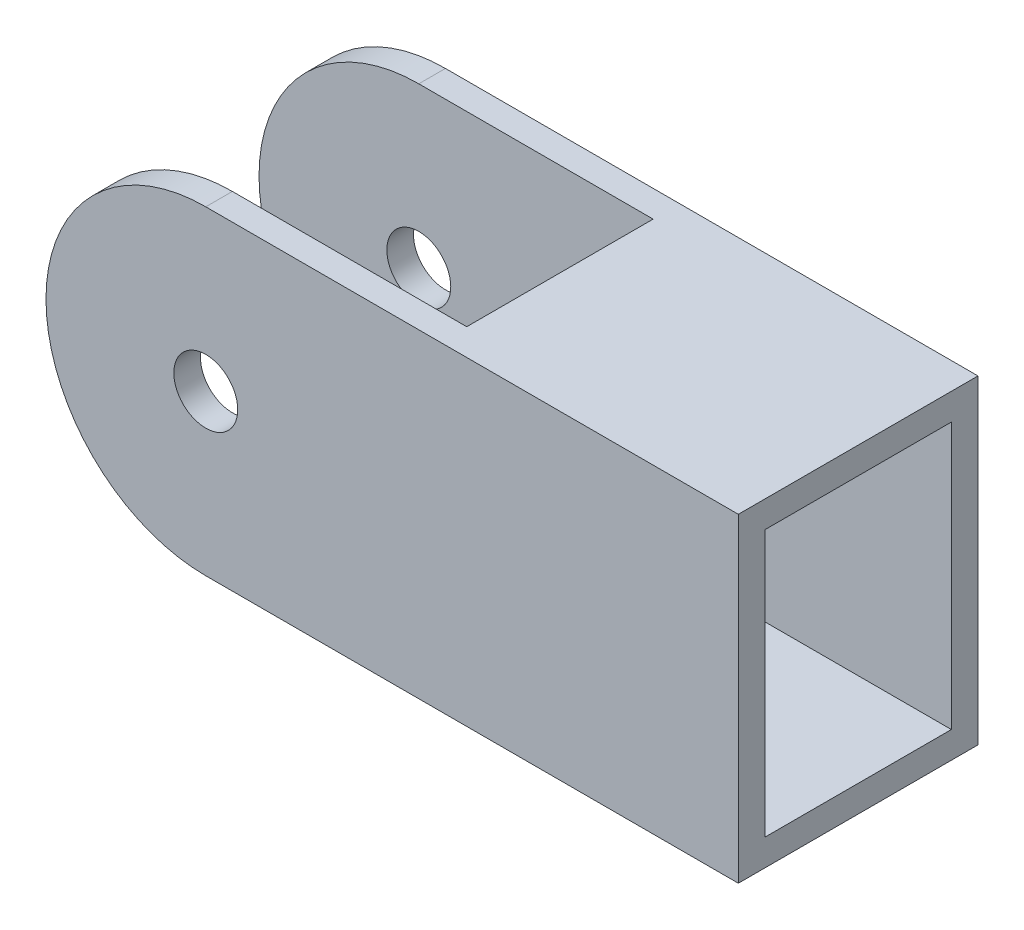
ISO-10303-21;
HEADER;
FILE_DESCRIPTION(('STEP AP214'),'2;1');
FILE_NAME('part.step','',(''),(''),'','','');
FILE_SCHEMA(('AUTOMOTIVE_DESIGN { 1 0 10303 214 1 1 1 1 }'));
ENDSEC;
DATA;
#1=APPLICATION_CONTEXT('core data for automotive mechanical design processes');
#2=APPLICATION_PROTOCOL_DEFINITION('international standard','automotive_design',2000,#1);
#3=PRODUCT_CONTEXT('',#1,'mechanical');
#4=PRODUCT('Part','Part','',(#3));
#5=PRODUCT_RELATED_PRODUCT_CATEGORY('part','',(#4));
#6=PRODUCT_DEFINITION_FORMATION('','',#4);
#7=PRODUCT_DEFINITION_CONTEXT('part definition',#1,'design');
#8=PRODUCT_DEFINITION('design','',#6,#7);
#9=PRODUCT_DEFINITION_SHAPE('','',#8);
#10=(LENGTH_UNIT() NAMED_UNIT(*) SI_UNIT(.MILLI.,.METRE.));
#11=(NAMED_UNIT(*) PLANE_ANGLE_UNIT() SI_UNIT($,.RADIAN.));
#12=(NAMED_UNIT(*) SI_UNIT($,.STERADIAN.) SOLID_ANGLE_UNIT());
#13=UNCERTAINTY_MEASURE_WITH_UNIT(LENGTH_MEASURE(1.E-05),#10,'distance_accuracy_value','');
#14=(GEOMETRIC_REPRESENTATION_CONTEXT(3) GLOBAL_UNCERTAINTY_ASSIGNED_CONTEXT((#13)) GLOBAL_UNIT_ASSIGNED_CONTEXT((#10,
#11,#12)) REPRESENTATION_CONTEXT('',''));
#15=CARTESIAN_POINT('',(0.,0.,0.));
#16=DIRECTION('',(0.,0.,1.));
#17=DIRECTION('',(1.,0.,0.));
#18=AXIS2_PLACEMENT_3D('',#15,#16,#17);
#19=CARTESIAN_POINT('',(50.,-30.,5.));
#20=DIRECTION('',(-1.,0.,0.));
#21=DIRECTION('',(0.,0.,1.));
#22=AXIS2_PLACEMENT_3D('',#19,#20,#21);
#23=PLANE('',#22);
#24=DIRECTION('',(0.,1.,0.));
#25=VECTOR('',#24,1.);
#26=CARTESIAN_POINT('',(50.,-30.,5.));
#27=LINE('',#26,#25);
#28=CARTESIAN_POINT('',(50.,-25.,5.));
#29=VERTEX_POINT('',#28);
#30=CARTESIAN_POINT('',(50.,25.,5.));
#31=VERTEX_POINT('',#30);
#32=EDGE_CURVE('E127',#29,#31,#27,.T.);
#33=ORIENTED_EDGE('',*,*,#32,.F.);
#34=DIRECTION('',(0.,0.,-1.));
#35=VECTOR('',#34,1.);
#36=CARTESIAN_POINT('',(50.,-25.,40.));
#37=LINE('',#36,#35);
#38=CARTESIAN_POINT('',(50.,-25.,40.));
#39=VERTEX_POINT('',#38);
#40=EDGE_CURVE('E120',#39,#29,#37,.T.);
#41=ORIENTED_EDGE('',*,*,#40,.F.);
#42=DIRECTION('',(0.,1.,0.));
#43=VECTOR('',#42,1.);
#44=CARTESIAN_POINT('',(50.,-30.,40.));
#45=LINE('',#44,#43);
#46=CARTESIAN_POINT('',(50.,25.,40.));
#47=VERTEX_POINT('',#46);
#48=EDGE_CURVE('E125',#39,#47,#45,.T.);
#49=ORIENTED_EDGE('',*,*,#48,.T.);
#50=DIRECTION('',(0.,0.,-1.));
#51=VECTOR('',#50,1.);
#52=CARTESIAN_POINT('',(50.,25.,40.));
#53=LINE('',#52,#51);
#54=EDGE_CURVE('E176',#47,#31,#53,.T.);
#55=ORIENTED_EDGE('',*,*,#54,.T.);
#56=EDGE_LOOP('',(#33,#41,#49,#55));
#57=FACE_BOUND('',#56,.T.);
#58=DIRECTION('',(0.,1.,0.));
#59=VECTOR('',#58,1.);
#60=CARTESIAN_POINT('',(50.,-30.,0.));
#61=LINE('',#60,#59);
#62=CARTESIAN_POINT('',(50.,-30.,0.));
#63=VERTEX_POINT('',#62);
#64=CARTESIAN_POINT('',(50.,30.,0.));
#65=VERTEX_POINT('',#64);
#66=EDGE_CURVE('E189',#63,#65,#61,.T.);
#67=ORIENTED_EDGE('',*,*,#66,.T.);
#68=DIRECTION('',(0.,0.,-1.));
#69=VECTOR('',#68,1.);
#70=CARTESIAN_POINT('',(50.,30.,5.));
#71=LINE('',#70,#69);
#72=CARTESIAN_POINT('',(50.,30.,45.));
#73=VERTEX_POINT('',#72);
#74=EDGE_CURVE('E11',#73,#65,#71,.T.);
#75=ORIENTED_EDGE('',*,*,#74,.F.);
#76=DIRECTION('',(0.,1.,0.));
#77=VECTOR('',#76,1.);
#78=CARTESIAN_POINT('',(50.,-30.,45.));
#79=LINE('',#78,#77);
#80=CARTESIAN_POINT('',(50.,-30.,45.));
#81=VERTEX_POINT('',#80);
#82=EDGE_CURVE('E162',#81,#73,#79,.T.);
#83=ORIENTED_EDGE('',*,*,#82,.F.);
#84=DIRECTION('',(0.,0.,-1.));
#85=VECTOR('',#84,1.);
#86=CARTESIAN_POINT('',(50.,-30.,5.));
#87=LINE('',#86,#85);
#88=EDGE_CURVE('E199',#81,#63,#87,.T.);
#89=ORIENTED_EDGE('',*,*,#88,.T.);
#90=EDGE_LOOP('',(#67,#75,#83,#89));
#91=FACE_BOUND('',#90,.T.);
#92=ADVANCED_FACE('F34',(#57,#91),#23,.F.);
#93=CARTESIAN_POINT('',(-50.,30.,5.));
#94=DIRECTION('',(0.,-1.,0.));
#95=DIRECTION('',(0.,0.,-1.));
#96=AXIS2_PLACEMENT_3D('',#93,#94,#95);
#97=PLANE('',#96);
#98=DIRECTION('',(-1.,0.,0.));
#99=VECTOR('',#98,1.);
#100=CARTESIAN_POINT('',(-50.,30.,0.));
#101=LINE('',#100,#99);
#102=CARTESIAN_POINT('',(-50.,30.,0.));
#103=VERTEX_POINT('',#102);
#104=EDGE_CURVE('E202',#65,#103,#101,.T.);
#105=ORIENTED_EDGE('',*,*,#104,.T.);
#106=DIRECTION('',(0.,0.,-1.));
#107=VECTOR('',#106,1.);
#108=CARTESIAN_POINT('',(-50.,30.,5.));
#109=LINE('',#108,#107);
#110=CARTESIAN_POINT('',(-50.,30.,5.));
#111=VERTEX_POINT('',#110);
#112=EDGE_CURVE('E41',#111,#103,#109,.T.);
#113=ORIENTED_EDGE('',*,*,#112,.F.);
#114=DIRECTION('',(-1.,0.,0.));
#115=VECTOR('',#114,1.);
#116=CARTESIAN_POINT('',(-50.,30.,5.));
#117=LINE('',#116,#115);
#118=CARTESIAN_POINT('',(-6.00000000000001,30.,5.));
#119=VERTEX_POINT('',#118);
#120=EDGE_CURVE('E193',#119,#111,#117,.T.);
#121=ORIENTED_EDGE('',*,*,#120,.F.);
#122=DIRECTION('',(0.,0.,-1.));
#123=VECTOR('',#122,1.);
#124=CARTESIAN_POINT('',(-6.00000000000001,30.,40.));
#125=LINE('',#124,#123);
#126=CARTESIAN_POINT('',(-6.00000000000001,30.,40.));
#127=VERTEX_POINT('',#126);
#128=EDGE_CURVE('E175',#127,#119,#125,.T.);
#129=ORIENTED_EDGE('',*,*,#128,.F.);
#130=DIRECTION('',(-1.,0.,0.));
#131=VECTOR('',#130,1.);
#132=CARTESIAN_POINT('',(-50.,30.,40.));
#133=LINE('',#132,#131);
#134=CARTESIAN_POINT('',(-50.,30.,40.));
#135=VERTEX_POINT('',#134);
#136=EDGE_CURVE('E144',#127,#135,#133,.T.);
#137=ORIENTED_EDGE('',*,*,#136,.T.);
#138=DIRECTION('',(0.,0.,1.));
#139=VECTOR('',#138,1.);
#140=CARTESIAN_POINT('',(-50.,30.,40.));
#141=LINE('',#140,#139);
#142=CARTESIAN_POINT('',(-50.,30.,45.));
#143=VERTEX_POINT('',#142);
#144=EDGE_CURVE('E172',#135,#143,#141,.T.);
#145=ORIENTED_EDGE('',*,*,#144,.T.);
#146=DIRECTION('',(-1.,0.,0.));
#147=VECTOR('',#146,1.);
#148=CARTESIAN_POINT('',(-50.,30.,45.));
#149=LINE('',#148,#147);
#150=EDGE_CURVE('E165',#73,#143,#149,.T.);
#151=ORIENTED_EDGE('',*,*,#150,.F.);
#152=ORIENTED_EDGE('',*,*,#74,.T.);
#153=EDGE_LOOP('',(#105,#113,#121,#129,#137,#145,#151,#152));
#154=FACE_BOUND('',#153,.T.);
#155=ADVANCED_FACE('F275',(#154),#97,.F.);
#156=CARTESIAN_POINT('',(-50.,0.,5.));
#157=DIRECTION('',(0.,0.,-1.));
#158=DIRECTION('',(-1.,0.,0.));
#159=AXIS2_PLACEMENT_3D('',#156,#157,#158);
#160=CYLINDRICAL_SURFACE('',#159,30.);
#161=CARTESIAN_POINT('',(-50.,0.,0.));
#162=DIRECTION('',(0.,0.,1.));
#163=DIRECTION('',(-1.,0.,0.));
#164=AXIS2_PLACEMENT_3D('',#161,#162,#163);
#165=CIRCLE('',#164,30.);
#166=CARTESIAN_POINT('',(-50.,-30.,0.));
#167=VERTEX_POINT('',#166);
#168=EDGE_CURVE('E204',#103,#167,#165,.T.);
#169=ORIENTED_EDGE('',*,*,#168,.T.);
#170=DIRECTION('',(0.,0.,-1.));
#171=VECTOR('',#170,1.);
#172=CARTESIAN_POINT('',(-50.,-30.,5.));
#173=LINE('',#172,#171);
#174=CARTESIAN_POINT('',(-50.,-30.,5.));
#175=VERTEX_POINT('',#174);
#176=EDGE_CURVE('E209',#175,#167,#173,.T.);
#177=ORIENTED_EDGE('',*,*,#176,.F.);
#178=CARTESIAN_POINT('',(-50.,0.,5.));
#179=DIRECTION('',(0.,0.,1.));
#180=DIRECTION('',(-1.,0.,0.));
#181=AXIS2_PLACEMENT_3D('',#178,#179,#180);
#182=CIRCLE('',#181,30.);
#183=EDGE_CURVE('E196',#111,#175,#182,.T.);
#184=ORIENTED_EDGE('',*,*,#183,.F.);
#185=ORIENTED_EDGE('',*,*,#112,.T.);
#186=EDGE_LOOP('',(#169,#177,#184,#185));
#187=FACE_BOUND('',#186,.T.);
#188=ADVANCED_FACE('F216',(#187),#160,.T.);
#189=CARTESIAN_POINT('',(-50.,-30.,5.));
#190=DIRECTION('',(0.,1.,0.));
#191=DIRECTION('',(0.,0.,1.));
#192=AXIS2_PLACEMENT_3D('',#189,#190,#191);
#193=PLANE('',#192);
#194=DIRECTION('',(1.,0.,0.));
#195=VECTOR('',#194,1.);
#196=CARTESIAN_POINT('',(-50.,-30.,0.));
#197=LINE('',#196,#195);
#198=EDGE_CURVE('E194',#167,#63,#197,.T.);
#199=ORIENTED_EDGE('',*,*,#198,.T.);
#200=ORIENTED_EDGE('',*,*,#88,.F.);
#201=DIRECTION('',(1.,0.,0.));
#202=VECTOR('',#201,1.);
#203=CARTESIAN_POINT('',(-50.,-30.,45.));
#204=LINE('',#203,#202);
#205=CARTESIAN_POINT('',(-50.,-30.,45.));
#206=VERTEX_POINT('',#205);
#207=EDGE_CURVE('E145',#206,#81,#204,.T.);
#208=ORIENTED_EDGE('',*,*,#207,.F.);
#209=DIRECTION('',(0.,0.,1.));
#210=VECTOR('',#209,1.);
#211=CARTESIAN_POINT('',(-50.,-30.,40.));
#212=LINE('',#211,#210);
#213=CARTESIAN_POINT('',(-50.,-30.,40.));
#214=VERTEX_POINT('',#213);
#215=EDGE_CURVE('E161',#214,#206,#212,.T.);
#216=ORIENTED_EDGE('',*,*,#215,.F.);
#217=DIRECTION('',(1.,0.,0.));
#218=VECTOR('',#217,1.);
#219=CARTESIAN_POINT('',(-50.,-30.,40.));
#220=LINE('',#219,#218);
#221=CARTESIAN_POINT('',(-6.00000000000001,-30.,40.));
#222=VERTEX_POINT('',#221);
#223=EDGE_CURVE('E158',#214,#222,#220,.T.);
#224=ORIENTED_EDGE('',*,*,#223,.T.);
#225=DIRECTION('',(0.,0.,-1.));
#226=VECTOR('',#225,1.);
#227=CARTESIAN_POINT('',(-6.00000000000001,-30.,40.));
#228=LINE('',#227,#226);
#229=CARTESIAN_POINT('',(-6.00000000000001,-30.,5.));
#230=VERTEX_POINT('',#229);
#231=EDGE_CURVE('E130',#222,#230,#228,.T.);
#232=ORIENTED_EDGE('',*,*,#231,.T.);
#233=DIRECTION('',(1.,0.,0.));
#234=VECTOR('',#233,1.);
#235=CARTESIAN_POINT('',(-50.,-30.,5.));
#236=LINE('',#235,#234);
#237=EDGE_CURVE('E53',#175,#230,#236,.T.);
#238=ORIENTED_EDGE('',*,*,#237,.F.);
#239=ORIENTED_EDGE('',*,*,#176,.T.);
#240=EDGE_LOOP('',(#199,#200,#208,#216,#224,#232,#238,#239));
#241=FACE_BOUND('',#240,.T.);
#242=ADVANCED_FACE('F225',(#241),#193,.F.);
#243=CARTESIAN_POINT('',(-50.,0.,5.));
#244=DIRECTION('',(0.,0.,-1.));
#245=DIRECTION('',(-1.,0.,0.));
#246=AXIS2_PLACEMENT_3D('',#243,#244,#245);
#247=PLANE('',#246);
#248=CARTESIAN_POINT('',(-50.,0.,5.));
#249=DIRECTION('',(0.,0.,-1.));
#250=DIRECTION('',(-1.,0.,0.));
#251=AXIS2_PLACEMENT_3D('',#248,#249,#250);
#252=CIRCLE('',#251,5.99999999999999);
#253=CARTESIAN_POINT('',(-44.,0.,5.));
#254=VERTEX_POINT('',#253);
#255=EDGE_CURVE('E237',#254,#254,#252,.T.);
#256=ORIENTED_EDGE('',*,*,#255,.T.);
#257=EDGE_LOOP('',(#256));
#258=FACE_BOUND('',#257,.T.);
#259=ORIENTED_EDGE('',*,*,#237,.T.);
#260=DIRECTION('',(0.,-1.,0.));
#261=VECTOR('',#260,1.);
#262=CARTESIAN_POINT('',(-6.00000000000001,-25.,5.));
#263=LINE('',#262,#261);
#264=CARTESIAN_POINT('',(-6.00000000000001,-25.,5.));
#265=VERTEX_POINT('',#264);
#266=EDGE_CURVE('E48',#265,#230,#263,.T.);
#267=ORIENTED_EDGE('',*,*,#266,.F.);
#268=DIRECTION('',(-1.,0.,0.));
#269=VECTOR('',#268,1.);
#270=CARTESIAN_POINT('',(50.,-25.,5.));
#271=LINE('',#270,#269);
#272=EDGE_CURVE('E243',#29,#265,#271,.T.);
#273=ORIENTED_EDGE('',*,*,#272,.F.);
#274=ORIENTED_EDGE('',*,*,#32,.T.);
#275=DIRECTION('',(-1.,0.,0.));
#276=VECTOR('',#275,1.);
#277=CARTESIAN_POINT('',(50.,25.,5.));
#278=LINE('',#277,#276);
#279=CARTESIAN_POINT('',(-6.00000000000001,25.,5.));
#280=VERTEX_POINT('',#279);
#281=EDGE_CURVE('E178',#31,#280,#278,.T.);
#282=ORIENTED_EDGE('',*,*,#281,.T.);
#283=DIRECTION('',(0.,1.,0.));
#284=VECTOR('',#283,1.);
#285=CARTESIAN_POINT('',(-6.00000000000001,25.,5.));
#286=LINE('',#285,#284);
#287=EDGE_CURVE('E184',#280,#119,#286,.T.);
#288=ORIENTED_EDGE('',*,*,#287,.T.);
#289=ORIENTED_EDGE('',*,*,#120,.T.);
#290=ORIENTED_EDGE('',*,*,#183,.T.);
#291=EDGE_LOOP('',(#259,#267,#273,#274,#282,#288,#289,#290));
#292=FACE_BOUND('',#291,.T.);
#293=ADVANCED_FACE('F263',(#258,#292),#247,.F.);
#294=CARTESIAN_POINT('',(-50.,0.,0.));
#295=DIRECTION('',(0.,0.,-1.));
#296=DIRECTION('',(-1.,0.,0.));
#297=AXIS2_PLACEMENT_3D('',#294,#295,#296);
#298=PLANE('',#297);
#299=CARTESIAN_POINT('',(-50.,0.,0.));
#300=DIRECTION('',(0.,0.,1.));
#301=DIRECTION('',(1.,0.,0.));
#302=AXIS2_PLACEMENT_3D('',#299,#300,#301);
#303=CIRCLE('',#302,5.99999999999999);
#304=CARTESIAN_POINT('',(-44.,0.,0.));
#305=VERTEX_POINT('',#304);
#306=EDGE_CURVE('E248',#305,#305,#303,.T.);
#307=ORIENTED_EDGE('',*,*,#306,.T.);
#308=EDGE_LOOP('',(#307));
#309=FACE_BOUND('',#308,.T.);
#310=ORIENTED_EDGE('',*,*,#66,.F.);
#311=ORIENTED_EDGE('',*,*,#198,.F.);
#312=ORIENTED_EDGE('',*,*,#168,.F.);
#313=ORIENTED_EDGE('',*,*,#104,.F.);
#314=EDGE_LOOP('',(#310,#311,#312,#313));
#315=FACE_BOUND('',#314,.T.);
#316=ADVANCED_FACE('F223',(#309,#315),#298,.T.);
#317=CARTESIAN_POINT('',(-6.00000000000001,25.,40.));
#318=DIRECTION('',(1.,0.,0.));
#319=DIRECTION('',(0.,0.,-1.));
#320=AXIS2_PLACEMENT_3D('',#317,#318,#319);
#321=PLANE('',#320);
#322=ORIENTED_EDGE('',*,*,#128,.T.);
#323=ORIENTED_EDGE('',*,*,#287,.F.);
#324=DIRECTION('',(0.,0.,-1.));
#325=VECTOR('',#324,1.);
#326=CARTESIAN_POINT('',(-6.00000000000001,25.,40.));
#327=LINE('',#326,#325);
#328=CARTESIAN_POINT('',(-6.00000000000001,25.,40.));
#329=VERTEX_POINT('',#328);
#330=EDGE_CURVE('E181',#329,#280,#327,.T.);
#331=ORIENTED_EDGE('',*,*,#330,.F.);
#332=DIRECTION('',(0.,1.,0.));
#333=VECTOR('',#332,1.);
#334=CARTESIAN_POINT('',(-6.00000000000001,25.,40.));
#335=LINE('',#334,#333);
#336=EDGE_CURVE('E186',#329,#127,#335,.T.);
#337=ORIENTED_EDGE('',*,*,#336,.T.);
#338=EDGE_LOOP('',(#322,#323,#331,#337));
#339=FACE_BOUND('',#338,.T.);
#340=ADVANCED_FACE('F270',(#339),#321,.F.);
#341=CARTESIAN_POINT('',(0.,25.,0.));
#342=DIRECTION('',(0.,1.,0.));
#343=DIRECTION('',(0.,0.,1.));
#344=AXIS2_PLACEMENT_3D('',#341,#342,#343);
#345=PLANE('',#344);
#346=ORIENTED_EDGE('',*,*,#54,.F.);
#347=DIRECTION('',(-1.,0.,0.));
#348=VECTOR('',#347,1.);
#349=CARTESIAN_POINT('',(50.,25.,40.));
#350=LINE('',#349,#348);
#351=EDGE_CURVE('E142',#47,#329,#350,.T.);
#352=ORIENTED_EDGE('',*,*,#351,.T.);
#353=ORIENTED_EDGE('',*,*,#330,.T.);
#354=ORIENTED_EDGE('',*,*,#281,.F.);
#355=EDGE_LOOP('',(#346,#352,#353,#354));
#356=FACE_BOUND('',#355,.T.);
#357=ADVANCED_FACE('F289',(#356),#345,.F.);
#358=CARTESIAN_POINT('',(-50.,0.,40.));
#359=DIRECTION('',(0.,0.,1.));
#360=DIRECTION('',(-1.,0.,0.));
#361=AXIS2_PLACEMENT_3D('',#358,#359,#360);
#362=CYLINDRICAL_SURFACE('',#361,30.);
#363=CARTESIAN_POINT('',(-50.,0.,45.));
#364=DIRECTION('',(0.,0.,1.));
#365=DIRECTION('',(-1.,0.,0.));
#366=AXIS2_PLACEMENT_3D('',#363,#364,#365);
#367=CIRCLE('',#366,30.);
#368=EDGE_CURVE('E150',#143,#206,#367,.T.);
#369=ORIENTED_EDGE('',*,*,#368,.F.);
#370=ORIENTED_EDGE('',*,*,#144,.F.);
#371=CARTESIAN_POINT('',(-50.,0.,40.));
#372=DIRECTION('',(0.,0.,1.));
#373=DIRECTION('',(-1.,0.,0.));
#374=AXIS2_PLACEMENT_3D('',#371,#372,#373);
#375=CIRCLE('',#374,30.);
#376=EDGE_CURVE('E147',#135,#214,#375,.T.);
#377=ORIENTED_EDGE('',*,*,#376,.T.);
#378=ORIENTED_EDGE('',*,*,#215,.T.);
#379=EDGE_LOOP('',(#369,#370,#377,#378));
#380=FACE_BOUND('',#379,.T.);
#381=ADVANCED_FACE('F232',(#380),#362,.T.);
#382=CARTESIAN_POINT('',(-50.,0.,40.));
#383=DIRECTION('',(0.,0.,1.));
#384=DIRECTION('',(-1.,0.,0.));
#385=AXIS2_PLACEMENT_3D('',#382,#383,#384);
#386=PLANE('',#385);
#387=CARTESIAN_POINT('',(-50.,0.,40.));
#388=DIRECTION('',(0.,0.,1.));
#389=DIRECTION('',(1.,0.,0.));
#390=AXIS2_PLACEMENT_3D('',#387,#388,#389);
#391=CIRCLE('',#390,5.99999999999999);
#392=CARTESIAN_POINT('',(-44.,0.,40.));
#393=VERTEX_POINT('',#392);
#394=EDGE_CURVE('E240',#393,#393,#391,.T.);
#395=ORIENTED_EDGE('',*,*,#394,.T.);
#396=EDGE_LOOP('',(#395));
#397=FACE_BOUND('',#396,.T.);
#398=DIRECTION('',(-1.,0.,0.));
#399=VECTOR('',#398,1.);
#400=CARTESIAN_POINT('',(50.,-25.,40.));
#401=LINE('',#400,#399);
#402=CARTESIAN_POINT('',(-6.00000000000001,-25.,40.));
#403=VERTEX_POINT('',#402);
#404=EDGE_CURVE('E129',#39,#403,#401,.T.);
#405=ORIENTED_EDGE('',*,*,#404,.T.);
#406=DIRECTION('',(0.,-1.,0.));
#407=VECTOR('',#406,1.);
#408=CARTESIAN_POINT('',(-6.00000000000001,-25.,40.));
#409=LINE('',#408,#407);
#410=EDGE_CURVE('E153',#403,#222,#409,.T.);
#411=ORIENTED_EDGE('',*,*,#410,.T.);
#412=ORIENTED_EDGE('',*,*,#223,.F.);
#413=ORIENTED_EDGE('',*,*,#376,.F.);
#414=ORIENTED_EDGE('',*,*,#136,.F.);
#415=ORIENTED_EDGE('',*,*,#336,.F.);
#416=ORIENTED_EDGE('',*,*,#351,.F.);
#417=ORIENTED_EDGE('',*,*,#48,.F.);
#418=EDGE_LOOP('',(#405,#411,#412,#413,#414,#415,#416,#417));
#419=FACE_BOUND('',#418,.T.);
#420=ADVANCED_FACE('F140',(#397,#419),#386,.F.);
#421=CARTESIAN_POINT('',(-50.,0.,45.));
#422=DIRECTION('',(0.,0.,1.));
#423=DIRECTION('',(-1.,0.,0.));
#424=AXIS2_PLACEMENT_3D('',#421,#422,#423);
#425=PLANE('',#424);
#426=CARTESIAN_POINT('',(-50.,0.,45.));
#427=DIRECTION('',(0.,0.,1.));
#428=DIRECTION('',(1.,0.,0.));
#429=AXIS2_PLACEMENT_3D('',#426,#427,#428);
#430=CIRCLE('',#429,5.99999999999999);
#431=CARTESIAN_POINT('',(-44.,0.,45.));
#432=VERTEX_POINT('',#431);
#433=EDGE_CURVE('E249',#432,#432,#430,.T.);
#434=ORIENTED_EDGE('',*,*,#433,.F.);
#435=EDGE_LOOP('',(#434));
#436=FACE_BOUND('',#435,.T.);
#437=ORIENTED_EDGE('',*,*,#82,.T.);
#438=ORIENTED_EDGE('',*,*,#150,.T.);
#439=ORIENTED_EDGE('',*,*,#368,.T.);
#440=ORIENTED_EDGE('',*,*,#207,.T.);
#441=EDGE_LOOP('',(#437,#438,#439,#440));
#442=FACE_BOUND('',#441,.T.);
#443=ADVANCED_FACE('F229',(#436,#442),#425,.T.);
#444=CARTESIAN_POINT('',(-6.00000000000001,-25.,40.));
#445=DIRECTION('',(-1.,0.,0.));
#446=DIRECTION('',(0.,0.,1.));
#447=AXIS2_PLACEMENT_3D('',#444,#445,#446);
#448=PLANE('',#447);
#449=ORIENTED_EDGE('',*,*,#231,.F.);
#450=ORIENTED_EDGE('',*,*,#410,.F.);
#451=DIRECTION('',(0.,0.,-1.));
#452=VECTOR('',#451,1.);
#453=CARTESIAN_POINT('',(-6.00000000000001,-25.,40.));
#454=LINE('',#453,#452);
#455=EDGE_CURVE('E136',#403,#265,#454,.T.);
#456=ORIENTED_EDGE('',*,*,#455,.T.);
#457=ORIENTED_EDGE('',*,*,#266,.T.);
#458=EDGE_LOOP('',(#449,#450,#456,#457));
#459=FACE_BOUND('',#458,.T.);
#460=ADVANCED_FACE('F300',(#459),#448,.T.);
#461=CARTESIAN_POINT('',(0.,-25.,0.));
#462=DIRECTION('',(0.,-1.,0.));
#463=DIRECTION('',(0.,0.,1.));
#464=AXIS2_PLACEMENT_3D('',#461,#462,#463);
#465=PLANE('',#464);
#466=ORIENTED_EDGE('',*,*,#40,.T.);
#467=ORIENTED_EDGE('',*,*,#272,.T.);
#468=ORIENTED_EDGE('',*,*,#455,.F.);
#469=ORIENTED_EDGE('',*,*,#404,.F.);
#470=EDGE_LOOP('',(#466,#467,#468,#469));
#471=FACE_BOUND('',#470,.T.);
#472=ADVANCED_FACE('F134',(#471),#465,.F.);
#473=CARTESIAN_POINT('',(-50.,0.,0.));
#474=DIRECTION('',(0.,0.,1.));
#475=DIRECTION('',(1.,0.,0.));
#476=AXIS2_PLACEMENT_3D('',#473,#474,#475);
#477=CYLINDRICAL_SURFACE('',#476,5.99999999999999);
#478=CARTESIAN_POINT('',(-44.,0.,45.));
#479=CARTESIAN_POINT('',(-44.,0.,44.9479166666667));
#480=CARTESIAN_POINT('',(-44.,0.,44.8958333333333));
#481=CARTESIAN_POINT('',(-44.,0.,44.7916666666667));
#482=CARTESIAN_POINT('',(-44.,0.,44.7395833333333));
#483=CARTESIAN_POINT('',(-44.,0.,44.6354166666667));
#484=CARTESIAN_POINT('',(-44.,0.,44.5833333333333));
#485=CARTESIAN_POINT('',(-44.,0.,44.4791666666667));
#486=CARTESIAN_POINT('',(-44.,0.,44.4270833333333));
#487=CARTESIAN_POINT('',(-44.,0.,44.3229166666667));
#488=CARTESIAN_POINT('',(-44.,0.,44.2708333333333));
#489=CARTESIAN_POINT('',(-44.,0.,44.1666666666667));
#490=CARTESIAN_POINT('',(-44.,0.,44.1145833333333));
#491=CARTESIAN_POINT('',(-44.,0.,44.0104166666667));
#492=CARTESIAN_POINT('',(-44.,0.,43.9583333333333));
#493=CARTESIAN_POINT('',(-44.,0.,43.8541666666667));
#494=CARTESIAN_POINT('',(-44.,0.,43.8020833333333));
#495=CARTESIAN_POINT('',(-44.,0.,43.6979166666667));
#496=CARTESIAN_POINT('',(-44.,0.,43.6458333333333));
#497=CARTESIAN_POINT('',(-44.,0.,43.5416666666667));
#498=CARTESIAN_POINT('',(-44.,0.,43.4895833333333));
#499=CARTESIAN_POINT('',(-44.,0.,43.3854166666667));
#500=CARTESIAN_POINT('',(-44.,0.,43.3333333333333));
#501=CARTESIAN_POINT('',(-44.,0.,43.2291666666667));
#502=CARTESIAN_POINT('',(-44.,0.,43.1770833333333));
#503=CARTESIAN_POINT('',(-44.,0.,43.0729166666667));
#504=CARTESIAN_POINT('',(-44.,0.,43.0208333333333));
#505=CARTESIAN_POINT('',(-44.,0.,42.9166666666667));
#506=CARTESIAN_POINT('',(-44.,0.,42.8645833333333));
#507=CARTESIAN_POINT('',(-44.,0.,42.7604166666667));
#508=CARTESIAN_POINT('',(-44.,0.,42.7083333333333));
#509=CARTESIAN_POINT('',(-44.,0.,42.6041666666667));
#510=CARTESIAN_POINT('',(-44.,0.,42.5520833333333));
#511=CARTESIAN_POINT('',(-44.,0.,42.4479166666667));
#512=CARTESIAN_POINT('',(-44.,0.,42.3958333333333));
#513=CARTESIAN_POINT('',(-44.,0.,42.2916666666667));
#514=CARTESIAN_POINT('',(-44.,0.,42.2395833333333));
#515=CARTESIAN_POINT('',(-44.,0.,42.1354166666667));
#516=CARTESIAN_POINT('',(-44.,0.,42.0833333333333));
#517=CARTESIAN_POINT('',(-44.,0.,41.9791666666667));
#518=CARTESIAN_POINT('',(-44.,0.,41.9270833333333));
#519=CARTESIAN_POINT('',(-44.,0.,41.8229166666667));
#520=CARTESIAN_POINT('',(-44.,0.,41.7708333333333));
#521=CARTESIAN_POINT('',(-44.,0.,41.6666666666667));
#522=CARTESIAN_POINT('',(-44.,0.,41.6145833333333));
#523=CARTESIAN_POINT('',(-44.,0.,41.5104166666667));
#524=CARTESIAN_POINT('',(-44.,0.,41.4583333333333));
#525=CARTESIAN_POINT('',(-44.,0.,41.3541666666667));
#526=CARTESIAN_POINT('',(-44.,0.,41.3020833333333));
#527=CARTESIAN_POINT('',(-44.,0.,41.1979166666667));
#528=CARTESIAN_POINT('',(-44.,0.,41.1458333333333));
#529=CARTESIAN_POINT('',(-44.,0.,41.0416666666667));
#530=CARTESIAN_POINT('',(-44.,0.,40.9895833333333));
#531=CARTESIAN_POINT('',(-44.,0.,40.8854166666667));
#532=CARTESIAN_POINT('',(-44.,0.,40.8333333333333));
#533=CARTESIAN_POINT('',(-44.,0.,40.7291666666667));
#534=CARTESIAN_POINT('',(-44.,0.,40.6770833333333));
#535=CARTESIAN_POINT('',(-44.,0.,40.5729166666667));
#536=CARTESIAN_POINT('',(-44.,0.,40.5208333333333));
#537=CARTESIAN_POINT('',(-44.,0.,40.4166666666667));
#538=CARTESIAN_POINT('',(-44.,0.,40.3645833333333));
#539=CARTESIAN_POINT('',(-44.,0.,40.2604166666667));
#540=CARTESIAN_POINT('',(-44.,0.,40.2083333333333));
#541=CARTESIAN_POINT('',(-44.,0.,40.1041666666667));
#542=CARTESIAN_POINT('',(-44.,0.,40.0520833333333));
#543=CARTESIAN_POINT('',(-44.,0.,40.));
#544=B_SPLINE_CURVE_WITH_KNOTS('',3,(#478,#479,#480,#481,#482,#483,#484,#485,#486,#487,#488,
#489,#490,#491,#492,#493,#494,#495,#496,#497,#498,#499,#500,#501,#502,#503,#504,#505,#506,#507,
#508,#509,#510,#511,#512,#513,#514,#515,#516,#517,#518,#519,#520,#521,#522,#523,#524,#525,#526,
#527,#528,#529,#530,#531,#532,#533,#534,#535,#536,#537,#538,#539,#540,#541,#542,#543),
.UNSPECIFIED.,.F.,.F.,(4,2,2,2,2,2,2,2,2,2,2,2,2,2,2,2,2,2,2,2,2,2,2,2,2,2,2,2,2,2,2,2,4),(0.,
0.156249999999997,0.3125,0.468750000000004,0.625000000000001,0.781249999999997,
0.937500000000001,1.09375,1.25,1.40625,1.5625,1.71875,1.875,2.03125,2.1875,2.34375000000001,2.5,
2.65625,2.8125,2.96875000000001,3.125,3.28125,3.4375,3.59375000000001,3.75,3.90625,4.0625,
4.21875000000001,4.375,4.53125,4.6875,4.84375000000001,5.),.UNSPECIFIED.);
#545=EDGE_CURVE('BSEAM259',#432,#393,#544,.T.);
#546=ORIENTED_EDGE('',*,*,#433,.T.);
#547=ORIENTED_EDGE('',*,*,#394,.F.);
#548=ORIENTED_EDGE('',*,*,#545,.T.);
#549=ORIENTED_EDGE('',*,*,#545,.F.);
#550=EDGE_LOOP('',(#546,#548,#547,#549));
#551=FACE_BOUND('',#550,.T.);
#552=ADVANCED_FACE('F259',(#551),#477,.F.);
#553=CARTESIAN_POINT('',(-44.,0.,0.));
#554=CARTESIAN_POINT('',(-44.,0.,0.0520833333333334));
#555=CARTESIAN_POINT('',(-44.,0.,0.104166666666667));
#556=CARTESIAN_POINT('',(-44.,0.,0.208333333333333));
#557=CARTESIAN_POINT('',(-44.,0.,0.260416666666667));
#558=CARTESIAN_POINT('',(-44.,0.,0.364583333333333));
#559=CARTESIAN_POINT('',(-44.,0.,0.416666666666667));
#560=CARTESIAN_POINT('',(-44.,0.,0.520833333333333));
#561=CARTESIAN_POINT('',(-44.,0.,0.572916666666667));
#562=CARTESIAN_POINT('',(-44.,0.,0.677083333333333));
#563=CARTESIAN_POINT('',(-44.,0.,0.729166666666667));
#564=CARTESIAN_POINT('',(-44.,0.,0.833333333333333));
#565=CARTESIAN_POINT('',(-44.,0.,0.885416666666667));
#566=CARTESIAN_POINT('',(-44.,0.,0.989583333333333));
#567=CARTESIAN_POINT('',(-44.,0.,1.04166666666667));
#568=CARTESIAN_POINT('',(-44.,0.,1.14583333333333));
#569=CARTESIAN_POINT('',(-44.,0.,1.19791666666667));
#570=CARTESIAN_POINT('',(-44.,0.,1.30208333333333));
#571=CARTESIAN_POINT('',(-44.,0.,1.35416666666667));
#572=CARTESIAN_POINT('',(-44.,0.,1.45833333333333));
#573=CARTESIAN_POINT('',(-44.,0.,1.51041666666667));
#574=CARTESIAN_POINT('',(-44.,0.,1.61458333333333));
#575=CARTESIAN_POINT('',(-44.,0.,1.66666666666667));
#576=CARTESIAN_POINT('',(-44.,0.,1.77083333333333));
#577=CARTESIAN_POINT('',(-44.,0.,1.82291666666667));
#578=CARTESIAN_POINT('',(-44.,0.,1.92708333333333));
#579=CARTESIAN_POINT('',(-44.,0.,1.97916666666667));
#580=CARTESIAN_POINT('',(-44.,0.,2.08333333333333));
#581=CARTESIAN_POINT('',(-44.,0.,2.13541666666667));
#582=CARTESIAN_POINT('',(-44.,0.,2.23958333333333));
#583=CARTESIAN_POINT('',(-44.,0.,2.29166666666667));
#584=CARTESIAN_POINT('',(-44.,0.,2.39583333333333));
#585=CARTESIAN_POINT('',(-44.,0.,2.44791666666667));
#586=CARTESIAN_POINT('',(-44.,0.,2.55208333333333));
#587=CARTESIAN_POINT('',(-44.,0.,2.60416666666667));
#588=CARTESIAN_POINT('',(-44.,0.,2.70833333333333));
#589=CARTESIAN_POINT('',(-44.,0.,2.76041666666667));
#590=CARTESIAN_POINT('',(-44.,0.,2.86458333333333));
#591=CARTESIAN_POINT('',(-44.,0.,2.91666666666667));
#592=CARTESIAN_POINT('',(-44.,0.,3.02083333333333));
#593=CARTESIAN_POINT('',(-44.,0.,3.07291666666667));
#594=CARTESIAN_POINT('',(-44.,0.,3.17708333333333));
#595=CARTESIAN_POINT('',(-44.,0.,3.22916666666667));
#596=CARTESIAN_POINT('',(-44.,0.,3.33333333333333));
#597=CARTESIAN_POINT('',(-44.,0.,3.38541666666667));
#598=CARTESIAN_POINT('',(-44.,0.,3.48958333333333));
#599=CARTESIAN_POINT('',(-44.,0.,3.54166666666667));
#600=CARTESIAN_POINT('',(-44.,0.,3.64583333333333));
#601=CARTESIAN_POINT('',(-44.,0.,3.69791666666667));
#602=CARTESIAN_POINT('',(-44.,0.,3.80208333333333));
#603=CARTESIAN_POINT('',(-44.,0.,3.85416666666667));
#604=CARTESIAN_POINT('',(-44.,0.,3.95833333333333));
#605=CARTESIAN_POINT('',(-44.,0.,4.01041666666667));
#606=CARTESIAN_POINT('',(-44.,0.,4.11458333333333));
#607=CARTESIAN_POINT('',(-44.,0.,4.16666666666667));
#608=CARTESIAN_POINT('',(-44.,0.,4.27083333333333));
#609=CARTESIAN_POINT('',(-44.,0.,4.32291666666667));
#610=CARTESIAN_POINT('',(-44.,0.,4.42708333333333));
#611=CARTESIAN_POINT('',(-44.,0.,4.47916666666667));
#612=CARTESIAN_POINT('',(-44.,0.,4.58333333333333));
#613=CARTESIAN_POINT('',(-44.,0.,4.63541666666667));
#614=CARTESIAN_POINT('',(-44.,0.,4.73958333333333));
#615=CARTESIAN_POINT('',(-44.,0.,4.79166666666667));
#616=CARTESIAN_POINT('',(-44.,0.,4.89583333333333));
#617=CARTESIAN_POINT('',(-44.,0.,4.94791666666667));
#618=CARTESIAN_POINT('',(-44.,0.,5.));
#619=B_SPLINE_CURVE_WITH_KNOTS('',3,(#553,#554,#555,#556,#557,#558,#559,#560,#561,#562,#563,
#564,#565,#566,#567,#568,#569,#570,#571,#572,#573,#574,#575,#576,#577,#578,#579,#580,#581,#582,
#583,#584,#585,#586,#587,#588,#589,#590,#591,#592,#593,#594,#595,#596,#597,#598,#599,#600,#601,
#602,#603,#604,#605,#606,#607,#608,#609,#610,#611,#612,#613,#614,#615,#616,#617,#618),
.UNSPECIFIED.,.F.,.F.,(4,2,2,2,2,2,2,2,2,2,2,2,2,2,2,2,2,2,2,2,2,2,2,2,2,2,2,2,2,2,2,2,4),(0.,
0.15625,0.3125,0.46875,0.625,0.78125,0.9375,1.09375,1.25,1.40625,1.5625,1.71875,1.875,2.03125,
2.1875,2.34375,2.5,2.65625,2.8125,2.96875,3.125,3.28125,3.4375,3.59375,3.75,3.90625,4.0625,
4.21875,4.375,4.53125,4.6875,4.84375,5.),.UNSPECIFIED.);
#620=EDGE_CURVE('BSEAM256',#305,#254,#619,.T.);
#621=ORIENTED_EDGE('',*,*,#306,.F.);
#622=ORIENTED_EDGE('',*,*,#255,.F.);
#623=ORIENTED_EDGE('',*,*,#620,.T.);
#624=ORIENTED_EDGE('',*,*,#620,.F.);
#625=EDGE_LOOP('',(#621,#623,#622,#624));
#626=FACE_BOUND('',#625,.T.);
#627=ADVANCED_FACE('F256',(#626),#477,.F.);
#628=CLOSED_SHELL('',(#92,#155,#188,#242,#293,#316,#340,#357,#381,#420,#443,#460,#472,#552,#627));
#629=MANIFOLD_SOLID_BREP('B2',#628);
#630=ADVANCED_BREP_SHAPE_REPRESENTATION('',(#18,#629),#14);
#631=SHAPE_DEFINITION_REPRESENTATION(#9,#630);
ENDSEC;
END-ISO-10303-21;
